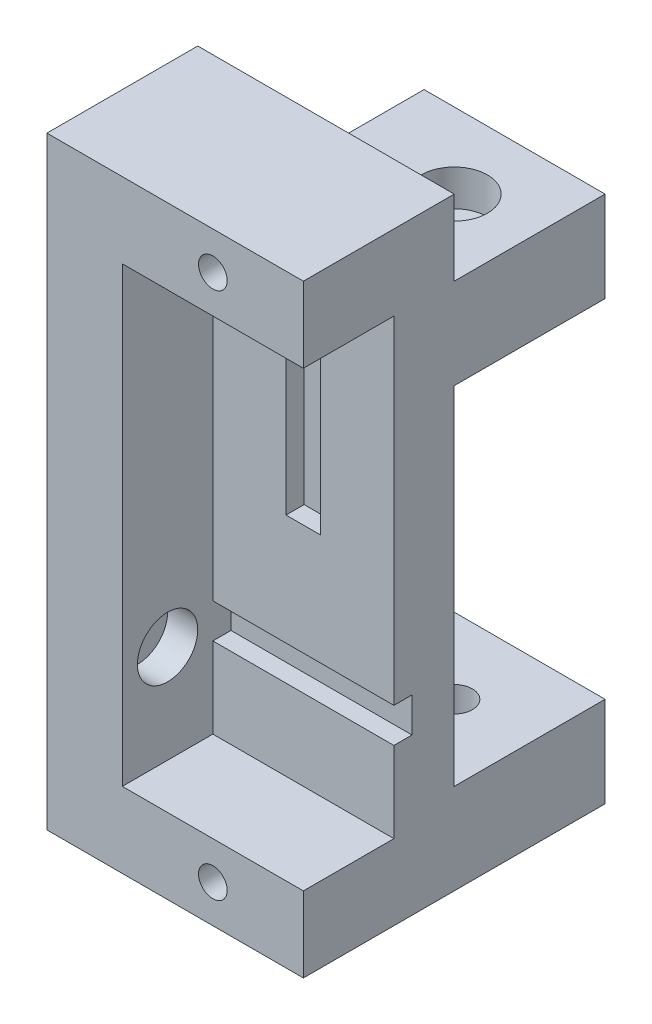
ISO-10303-21;
HEADER;
FILE_DESCRIPTION(('STEP AP214'),'2;1');
FILE_NAME('part.step','',(''),(''),'','','');
FILE_SCHEMA(('AUTOMOTIVE_DESIGN { 1 0 10303 214 1 1 1 1 }'));
ENDSEC;
DATA;
#1=APPLICATION_CONTEXT('core data for automotive mechanical design processes');
#2=APPLICATION_PROTOCOL_DEFINITION('international standard','automotive_design',2000,#1);
#3=PRODUCT_CONTEXT('',#1,'mechanical');
#4=PRODUCT('Part','Part','',(#3));
#5=PRODUCT_RELATED_PRODUCT_CATEGORY('part','',(#4));
#6=PRODUCT_DEFINITION_FORMATION('','',#4);
#7=PRODUCT_DEFINITION_CONTEXT('part definition',#1,'design');
#8=PRODUCT_DEFINITION('design','',#6,#7);
#9=PRODUCT_DEFINITION_SHAPE('','',#8);
#10=(LENGTH_UNIT() NAMED_UNIT(*) SI_UNIT(.MILLI.,.METRE.));
#11=(NAMED_UNIT(*) PLANE_ANGLE_UNIT() SI_UNIT($,.RADIAN.));
#12=(NAMED_UNIT(*) SI_UNIT($,.STERADIAN.) SOLID_ANGLE_UNIT());
#13=UNCERTAINTY_MEASURE_WITH_UNIT(LENGTH_MEASURE(1.E-05),#10,'distance_accuracy_value','');
#14=(GEOMETRIC_REPRESENTATION_CONTEXT(3) GLOBAL_UNCERTAINTY_ASSIGNED_CONTEXT((#13)) GLOBAL_UNIT_ASSIGNED_CONTEXT((#10,
#11,#12)) REPRESENTATION_CONTEXT('',''));
#15=CARTESIAN_POINT('',(0.,0.,0.));
#16=DIRECTION('',(0.,0.,1.));
#17=DIRECTION('',(1.,0.,0.));
#18=AXIS2_PLACEMENT_3D('',#15,#16,#17);
#19=CARTESIAN_POINT('',(0.,0.,4.));
#20=DIRECTION('',(0.,0.,-1.));
#21=DIRECTION('',(-1.,0.,0.));
#22=AXIS2_PLACEMENT_3D('',#19,#20,#21);
#23=PLANE('',#22);
#24=DIRECTION('',(0.,-1.,0.));
#25=VECTOR('',#24,1.);
#26=CARTESIAN_POINT('',(-2.,-17.5,4.));
#27=LINE('',#26,#25);
#28=CARTESIAN_POINT('',(-2.,17.5,4.));
#29=VERTEX_POINT('',#28);
#30=CARTESIAN_POINT('',(-2.,-4.85,4.));
#31=VERTEX_POINT('',#30);
#32=EDGE_CURVE('E399',#29,#31,#27,.T.);
#33=ORIENTED_EDGE('',*,*,#32,.T.);
#34=DIRECTION('',(-1.,0.,0.));
#35=VECTOR('',#34,1.);
#36=CARTESIAN_POINT('',(10.,-4.85,4.));
#37=LINE('',#36,#35);
#38=CARTESIAN_POINT('',(10.,-4.85,4.));
#39=VERTEX_POINT('',#38);
#40=EDGE_CURVE('E64',#39,#31,#37,.T.);
#41=ORIENTED_EDGE('',*,*,#40,.F.);
#42=DIRECTION('',(0.,1.,0.));
#43=VECTOR('',#42,1.);
#44=CARTESIAN_POINT('',(10.,-17.5,4.));
#45=LINE('',#44,#43);
#46=CARTESIAN_POINT('',(10.,17.5,4.));
#47=VERTEX_POINT('',#46);
#48=EDGE_CURVE('E402',#39,#47,#45,.T.);
#49=ORIENTED_EDGE('',*,*,#48,.T.);
#50=DIRECTION('',(1.,0.,0.));
#51=VECTOR('',#50,1.);
#52=CARTESIAN_POINT('',(-2.,17.5,4.));
#53=LINE('',#52,#51);
#54=CARTESIAN_POINT('',(5.15000000000001,17.5,4.));
#55=VERTEX_POINT('',#54);
#56=EDGE_CURVE('E327',#55,#47,#53,.T.);
#57=ORIENTED_EDGE('',*,*,#56,.F.);
#58=DIRECTION('',(0.,1.,0.));
#59=VECTOR('',#58,1.);
#60=CARTESIAN_POINT('',(5.15,2.5,4.));
#61=LINE('',#60,#59);
#62=CARTESIAN_POINT('',(5.15,2.5,4.));
#63=VERTEX_POINT('',#62);
#64=EDGE_CURVE('E56',#63,#55,#61,.T.);
#65=ORIENTED_EDGE('',*,*,#64,.F.);
#66=DIRECTION('',(1.,0.,0.));
#67=VECTOR('',#66,1.);
#68=CARTESIAN_POINT('',(2.85000000000001,2.5,4.));
#69=LINE('',#68,#67);
#70=CARTESIAN_POINT('',(2.85000000000001,2.5,4.));
#71=VERTEX_POINT('',#70);
#72=EDGE_CURVE('E244',#71,#63,#69,.T.);
#73=ORIENTED_EDGE('',*,*,#72,.F.);
#74=DIRECTION('',(0.,-1.,0.));
#75=VECTOR('',#74,1.);
#76=CARTESIAN_POINT('',(2.85000000000001,17.5,4.));
#77=LINE('',#76,#75);
#78=CARTESIAN_POINT('',(2.85000000000001,17.5,4.));
#79=VERTEX_POINT('',#78);
#80=EDGE_CURVE('E226',#79,#71,#77,.T.);
#81=ORIENTED_EDGE('',*,*,#80,.F.);
#82=EDGE_CURVE('E337',#29,#79,#53,.T.);
#83=ORIENTED_EDGE('',*,*,#82,.F.);
#84=EDGE_LOOP('',(#33,#41,#49,#57,#65,#73,#81,#83));
#85=FACE_BOUND('',#84,.T.);
#86=ADVANCED_FACE('F39',(#85),#23,.F.);
#87=CARTESIAN_POINT('',(-2.,-17.5,4.));
#88=DIRECTION('',(0.,1.,0.));
#89=DIRECTION('',(0.,0.,1.));
#90=AXIS2_PLACEMENT_3D('',#87,#88,#89);
#91=PLANE('',#90);
#92=DIRECTION('',(1.,0.,0.));
#93=VECTOR('',#92,1.);
#94=CARTESIAN_POINT('',(-2.,-17.5,10.));
#95=LINE('',#94,#93);
#96=CARTESIAN_POINT('',(-7.,-17.5,10.));
#97=VERTEX_POINT('',#96);
#98=CARTESIAN_POINT('',(10.,-17.5,10.));
#99=VERTEX_POINT('',#98);
#100=EDGE_CURVE('E328',#97,#99,#95,.T.);
#101=ORIENTED_EDGE('',*,*,#100,.F.);
#102=DIRECTION('',(0.,0.,1.));
#103=VECTOR('',#102,1.);
#104=CARTESIAN_POINT('',(-7.,-17.5,10.));
#105=LINE('',#104,#103);
#106=CARTESIAN_POINT('',(-7.,-17.5,0.));
#107=VERTEX_POINT('',#106);
#108=EDGE_CURVE('E298',#107,#97,#105,.T.);
#109=ORIENTED_EDGE('',*,*,#108,.F.);
#110=DIRECTION('',(1.,0.,0.));
#111=VECTOR('',#110,1.);
#112=CARTESIAN_POINT('',(-7.,-17.5,0.));
#113=LINE('',#112,#111);
#114=CARTESIAN_POINT('',(-2.,-17.5,0.));
#115=VERTEX_POINT('',#114);
#116=EDGE_CURVE('E301',#107,#115,#113,.T.);
#117=ORIENTED_EDGE('',*,*,#116,.T.);
#118=DIRECTION('',(0.,0.,-1.));
#119=VECTOR('',#118,1.);
#120=CARTESIAN_POINT('',(-2.,-17.5,4.));
#121=LINE('',#120,#119);
#122=CARTESIAN_POINT('',(-2.,-17.5,-10.));
#123=VERTEX_POINT('',#122);
#124=EDGE_CURVE('E43',#115,#123,#121,.T.);
#125=ORIENTED_EDGE('',*,*,#124,.T.);
#126=DIRECTION('',(-1.,0.,0.));
#127=VECTOR('',#126,1.);
#128=CARTESIAN_POINT('',(-2.,-17.5,-10.));
#129=LINE('',#128,#127);
#130=CARTESIAN_POINT('',(10.,-17.5,-10.));
#131=VERTEX_POINT('',#130);
#132=EDGE_CURVE('E387',#131,#123,#129,.T.);
#133=ORIENTED_EDGE('',*,*,#132,.F.);
#134=DIRECTION('',(0.,0.,-1.));
#135=VECTOR('',#134,1.);
#136=CARTESIAN_POINT('',(10.,-17.5,4.));
#137=LINE('',#136,#135);
#138=EDGE_CURVE('E413',#99,#131,#137,.T.);
#139=ORIENTED_EDGE('',*,*,#138,.F.);
#140=EDGE_LOOP('',(#101,#109,#117,#125,#133,#139));
#141=FACE_BOUND('',#140,.T.);
#142=CARTESIAN_POINT('',(5.,-17.5,-5.));
#143=DIRECTION('',(0.,-1.,0.));
#144=DIRECTION('',(0.,0.,-1.));
#145=AXIS2_PLACEMENT_3D('',#142,#143,#144);
#146=CIRCLE('',#145,2.19999999999999);
#147=CARTESIAN_POINT('',(5.,-17.5,-7.19999999999999));
#148=VERTEX_POINT('',#147);
#149=EDGE_CURVE('E271',#148,#148,#146,.T.);
#150=ORIENTED_EDGE('',*,*,#149,.F.);
#151=EDGE_LOOP('',(#150));
#152=FACE_BOUND('',#151,.T.);
#153=ADVANCED_FACE('F428',(#141,#152),#91,.F.);
#154=CARTESIAN_POINT('',(-2.,-17.5,4.));
#155=DIRECTION('',(1.,0.,0.));
#156=DIRECTION('',(0.,0.,-1.));
#157=AXIS2_PLACEMENT_3D('',#154,#155,#156);
#158=PLANE('',#157);
#159=DIRECTION('',(0.,-1.,0.));
#160=VECTOR('',#159,1.);
#161=CARTESIAN_POINT('',(-2.,22.5,0.));
#162=LINE('',#161,#160);
#163=CARTESIAN_POINT('',(-2.,17.5,0.));
#164=VERTEX_POINT('',#163);
#165=CARTESIAN_POINT('',(-2.,11.5,0.));
#166=VERTEX_POINT('',#165);
#167=EDGE_CURVE('E11',#164,#166,#162,.T.);
#168=ORIENTED_EDGE('',*,*,#167,.F.);
#169=DIRECTION('',(0.,0.,1.));
#170=VECTOR('',#169,1.);
#171=CARTESIAN_POINT('',(-2.,17.5,-10.));
#172=LINE('',#171,#170);
#173=CARTESIAN_POINT('',(-2.,17.5,-10.));
#174=VERTEX_POINT('',#173);
#175=EDGE_CURVE('E375',#174,#164,#172,.T.);
#176=ORIENTED_EDGE('',*,*,#175,.F.);
#177=DIRECTION('',(0.,-1.,0.));
#178=VECTOR('',#177,1.);
#179=CARTESIAN_POINT('',(-2.,17.5,-10.));
#180=LINE('',#179,#178);
#181=CARTESIAN_POINT('',(-2.,11.5,-10.));
#182=VERTEX_POINT('',#181);
#183=EDGE_CURVE('E351',#174,#182,#180,.T.);
#184=ORIENTED_EDGE('',*,*,#183,.T.);
#185=DIRECTION('',(0.,0.,1.));
#186=VECTOR('',#185,1.);
#187=CARTESIAN_POINT('',(-2.,11.5,-10.));
#188=LINE('',#187,#186);
#189=EDGE_CURVE('E364',#182,#166,#188,.T.);
#190=ORIENTED_EDGE('',*,*,#189,.T.);
#191=EDGE_LOOP('',(#168,#176,#184,#190));
#192=FACE_BOUND('',#191,.T.);
#193=ADVANCED_FACE('F41',(#192),#158,.F.);
#194=CARTESIAN_POINT('',(-2.,-11.5,0.));
#195=VERTEX_POINT('',#194);
#196=EDGE_CURVE('E48',#195,#115,#162,.T.);
#197=ORIENTED_EDGE('',*,*,#196,.F.);
#198=DIRECTION('',(0.,0.,1.));
#199=VECTOR('',#198,1.);
#200=CARTESIAN_POINT('',(-2.,-11.5,-10.));
#201=LINE('',#200,#199);
#202=CARTESIAN_POINT('',(-2.,-11.5,-10.));
#203=VERTEX_POINT('',#202);
#204=EDGE_CURVE('E395',#203,#195,#201,.T.);
#205=ORIENTED_EDGE('',*,*,#204,.F.);
#206=DIRECTION('',(0.,1.,0.));
#207=VECTOR('',#206,1.);
#208=CARTESIAN_POINT('',(-2.,-17.5,-10.));
#209=LINE('',#208,#207);
#210=EDGE_CURVE('E379',#123,#203,#209,.T.);
#211=ORIENTED_EDGE('',*,*,#210,.F.);
#212=ORIENTED_EDGE('',*,*,#124,.F.);
#213=EDGE_LOOP('',(#197,#205,#211,#212));
#214=FACE_BOUND('',#213,.T.);
#215=ADVANCED_FACE('F461',(#214),#158,.F.);
#216=CARTESIAN_POINT('',(10.,-12.5,4.));
#217=VERTEX_POINT('',#216);
#218=CARTESIAN_POINT('',(10.,-7.15,4.));
#219=VERTEX_POINT('',#218);
#220=EDGE_CURVE('E403',#217,#219,#45,.T.);
#221=ORIENTED_EDGE('',*,*,#220,.T.);
#222=DIRECTION('',(1.,0.,0.));
#223=VECTOR('',#222,1.);
#224=CARTESIAN_POINT('',(-2.,-7.15,4.));
#225=LINE('',#224,#223);
#226=CARTESIAN_POINT('',(-2.,-7.15,4.));
#227=VERTEX_POINT('',#226);
#228=EDGE_CURVE('E221',#227,#219,#225,.T.);
#229=ORIENTED_EDGE('',*,*,#228,.F.);
#230=CARTESIAN_POINT('',(-2.,-12.5,4.));
#231=VERTEX_POINT('',#230);
#232=EDGE_CURVE('E204',#227,#231,#27,.T.);
#233=ORIENTED_EDGE('',*,*,#232,.T.);
#234=DIRECTION('',(-1.,0.,0.));
#235=VECTOR('',#234,1.);
#236=CARTESIAN_POINT('',(-2.,-12.5,4.));
#237=LINE('',#236,#235);
#238=EDGE_CURVE('E324',#217,#231,#237,.T.);
#239=ORIENTED_EDGE('',*,*,#238,.F.);
#240=EDGE_LOOP('',(#221,#229,#233,#239));
#241=FACE_BOUND('',#240,.T.);
#242=ADVANCED_FACE('F478',(#241),#23,.F.);
#243=CARTESIAN_POINT('',(10.,-17.5,4.));
#244=DIRECTION('',(-1.,0.,0.));
#245=DIRECTION('',(0.,0.,1.));
#246=AXIS2_PLACEMENT_3D('',#243,#244,#245);
#247=PLANE('',#246);
#248=ORIENTED_EDGE('',*,*,#48,.F.);
#249=DIRECTION('',(0.,0.,1.));
#250=VECTOR('',#249,1.);
#251=CARTESIAN_POINT('',(10.,-4.85,2.8));
#252=LINE('',#251,#250);
#253=CARTESIAN_POINT('',(10.,-4.85,2.8));
#254=VERTEX_POINT('',#253);
#255=EDGE_CURVE('E231',#254,#39,#252,.T.);
#256=ORIENTED_EDGE('',*,*,#255,.F.);
#257=DIRECTION('',(0.,1.,0.));
#258=VECTOR('',#257,1.);
#259=CARTESIAN_POINT('',(10.,-7.15,2.8));
#260=LINE('',#259,#258);
#261=CARTESIAN_POINT('',(10.,-7.15,2.8));
#262=VERTEX_POINT('',#261);
#263=EDGE_CURVE('E216',#262,#254,#260,.T.);
#264=ORIENTED_EDGE('',*,*,#263,.F.);
#265=DIRECTION('',(0.,0.,1.));
#266=VECTOR('',#265,1.);
#267=CARTESIAN_POINT('',(10.,-7.15,2.8));
#268=LINE('',#267,#266);
#269=EDGE_CURVE('E207',#262,#219,#268,.T.);
#270=ORIENTED_EDGE('',*,*,#269,.T.);
#271=ORIENTED_EDGE('',*,*,#220,.F.);
#272=DIRECTION('',(0.,0.,-1.));
#273=VECTOR('',#272,1.);
#274=CARTESIAN_POINT('',(10.,-12.5,10.));
#275=LINE('',#274,#273);
#276=CARTESIAN_POINT('',(10.,-12.5,10.));
#277=VERTEX_POINT('',#276);
#278=EDGE_CURVE('E310',#277,#217,#275,.T.);
#279=ORIENTED_EDGE('',*,*,#278,.F.);
#280=DIRECTION('',(0.,1.,0.));
#281=VECTOR('',#280,1.);
#282=CARTESIAN_POINT('',(10.,-17.5,10.));
#283=LINE('',#282,#281);
#284=EDGE_CURVE('E330',#99,#277,#283,.T.);
#285=ORIENTED_EDGE('',*,*,#284,.F.);
#286=ORIENTED_EDGE('',*,*,#138,.T.);
#287=DIRECTION('',(0.,-1.,0.));
#288=VECTOR('',#287,1.);
#289=CARTESIAN_POINT('',(10.,-17.5,-10.));
#290=LINE('',#289,#288);
#291=CARTESIAN_POINT('',(10.,-11.5,-10.));
#292=VERTEX_POINT('',#291);
#293=EDGE_CURVE('E384',#292,#131,#290,.T.);
#294=ORIENTED_EDGE('',*,*,#293,.F.);
#295=DIRECTION('',(0.,0.,1.));
#296=VECTOR('',#295,1.);
#297=CARTESIAN_POINT('',(10.,-11.5,-10.));
#298=LINE('',#297,#296);
#299=CARTESIAN_POINT('',(10.,-11.5,0.));
#300=VERTEX_POINT('',#299);
#301=EDGE_CURVE('E390',#292,#300,#298,.T.);
#302=ORIENTED_EDGE('',*,*,#301,.T.);
#303=DIRECTION('',(0.,1.,0.));
#304=VECTOR('',#303,1.);
#305=CARTESIAN_POINT('',(10.,-17.5,0.));
#306=LINE('',#305,#304);
#307=CARTESIAN_POINT('',(10.,11.5,0.));
#308=VERTEX_POINT('',#307);
#309=EDGE_CURVE('E407',#300,#308,#306,.T.);
#310=ORIENTED_EDGE('',*,*,#309,.T.);
#311=DIRECTION('',(0.,0.,1.));
#312=VECTOR('',#311,1.);
#313=CARTESIAN_POINT('',(10.,11.5,-10.));
#314=LINE('',#313,#312);
#315=CARTESIAN_POINT('',(10.,11.5,-10.));
#316=VERTEX_POINT('',#315);
#317=EDGE_CURVE('E369',#316,#308,#314,.T.);
#318=ORIENTED_EDGE('',*,*,#317,.F.);
#319=DIRECTION('',(0.,1.,0.));
#320=VECTOR('',#319,1.);
#321=CARTESIAN_POINT('',(10.,17.5,-10.));
#322=LINE('',#321,#320);
#323=CARTESIAN_POINT('',(10.,17.5,-10.));
#324=VERTEX_POINT('',#323);
#325=EDGE_CURVE('E358',#316,#324,#322,.T.);
#326=ORIENTED_EDGE('',*,*,#325,.T.);
#327=DIRECTION('',(0.,0.,1.));
#328=VECTOR('',#327,1.);
#329=CARTESIAN_POINT('',(10.,17.5,-10.));
#330=LINE('',#329,#328);
#331=CARTESIAN_POINT('',(10.,17.5,0.));
#332=VERTEX_POINT('',#331);
#333=EDGE_CURVE('E372',#324,#332,#330,.T.);
#334=ORIENTED_EDGE('',*,*,#333,.T.);
#335=CARTESIAN_POINT('',(10.,22.5,0.));
#336=VERTEX_POINT('',#335);
#337=EDGE_CURVE('E398',#332,#336,#306,.T.);
#338=ORIENTED_EDGE('',*,*,#337,.T.);
#339=DIRECTION('',(0.,0.,-1.));
#340=VECTOR('',#339,1.);
#341=CARTESIAN_POINT('',(10.,22.5,4.));
#342=LINE('',#341,#340);
#343=CARTESIAN_POINT('',(10.,22.5,10.));
#344=VERTEX_POINT('',#343);
#345=EDGE_CURVE('E406',#344,#336,#342,.T.);
#346=ORIENTED_EDGE('',*,*,#345,.F.);
#347=DIRECTION('',(0.,1.,0.));
#348=VECTOR('',#347,1.);
#349=CARTESIAN_POINT('',(10.,22.5,10.));
#350=LINE('',#349,#348);
#351=CARTESIAN_POINT('',(10.,17.5,10.));
#352=VERTEX_POINT('',#351);
#353=EDGE_CURVE('E336',#352,#344,#350,.T.);
#354=ORIENTED_EDGE('',*,*,#353,.F.);
#355=DIRECTION('',(0.,0.,-1.));
#356=VECTOR('',#355,1.);
#357=CARTESIAN_POINT('',(10.,17.5,10.));
#358=LINE('',#357,#356);
#359=EDGE_CURVE('E342',#352,#47,#358,.T.);
#360=ORIENTED_EDGE('',*,*,#359,.T.);
#361=EDGE_LOOP('',(#248,#256,#264,#270,#271,#279,#285,#286,#294,#302,#310,#318,#326,#334,#338,
#346,#354,#360));
#362=FACE_BOUND('',#361,.T.);
#363=ADVANCED_FACE('F444',(#362),#247,.F.);
#364=CARTESIAN_POINT('',(-2.,22.5,4.));
#365=DIRECTION('',(0.,-1.,0.));
#366=DIRECTION('',(0.,0.,-1.));
#367=AXIS2_PLACEMENT_3D('',#364,#365,#366);
#368=PLANE('',#367);
#369=DIRECTION('',(-1.,0.,0.));
#370=VECTOR('',#369,1.);
#371=CARTESIAN_POINT('',(-2.,22.5,0.));
#372=LINE('',#371,#370);
#373=CARTESIAN_POINT('',(-7.,22.5,0.));
#374=VERTEX_POINT('',#373);
#375=EDGE_CURVE('E410',#336,#374,#372,.T.);
#376=ORIENTED_EDGE('',*,*,#375,.T.);
#377=DIRECTION('',(0.,0.,-1.));
#378=VECTOR('',#377,1.);
#379=CARTESIAN_POINT('',(-7.,22.5,10.));
#380=LINE('',#379,#378);
#381=CARTESIAN_POINT('',(-7.,22.5,10.));
#382=VERTEX_POINT('',#381);
#383=EDGE_CURVE('E293',#382,#374,#380,.T.);
#384=ORIENTED_EDGE('',*,*,#383,.F.);
#385=DIRECTION('',(-1.,0.,0.));
#386=VECTOR('',#385,1.);
#387=CARTESIAN_POINT('',(-2.,22.5,10.));
#388=LINE('',#387,#386);
#389=EDGE_CURVE('E340',#344,#382,#388,.T.);
#390=ORIENTED_EDGE('',*,*,#389,.F.);
#391=ORIENTED_EDGE('',*,*,#345,.T.);
#392=EDGE_LOOP('',(#376,#384,#390,#391));
#393=FACE_BOUND('',#392,.T.);
#394=ADVANCED_FACE('F440',(#393),#368,.F.);
#395=CARTESIAN_POINT('',(0.,0.,0.));
#396=DIRECTION('',(0.,0.,-1.));
#397=DIRECTION('',(-1.,0.,0.));
#398=AXIS2_PLACEMENT_3D('',#395,#396,#397);
#399=PLANE('',#398);
#400=DIRECTION('',(1.,0.,0.));
#401=VECTOR('',#400,1.);
#402=CARTESIAN_POINT('',(-2.,11.5,0.));
#403=LINE('',#402,#401);
#404=EDGE_CURVE('E355',#166,#308,#403,.T.);
#405=ORIENTED_EDGE('',*,*,#404,.T.);
#406=ORIENTED_EDGE('',*,*,#309,.F.);
#407=DIRECTION('',(1.,0.,0.));
#408=VECTOR('',#407,1.);
#409=CARTESIAN_POINT('',(-2.,-11.5,0.));
#410=LINE('',#409,#408);
#411=EDGE_CURVE('E378',#195,#300,#410,.T.);
#412=ORIENTED_EDGE('',*,*,#411,.F.);
#413=ORIENTED_EDGE('',*,*,#196,.T.);
#414=ORIENTED_EDGE('',*,*,#116,.F.);
#415=DIRECTION('',(0.,-1.,0.));
#416=VECTOR('',#415,1.);
#417=CARTESIAN_POINT('',(-7.,22.5,0.));
#418=LINE('',#417,#416);
#419=EDGE_CURVE('E296',#374,#107,#418,.T.);
#420=ORIENTED_EDGE('',*,*,#419,.F.);
#421=ORIENTED_EDGE('',*,*,#375,.F.);
#422=ORIENTED_EDGE('',*,*,#337,.F.);
#423=DIRECTION('',(-1.,0.,0.));
#424=VECTOR('',#423,1.);
#425=CARTESIAN_POINT('',(-2.,17.5,0.));
#426=LINE('',#425,#424);
#427=EDGE_CURVE('E350',#332,#164,#426,.T.);
#428=ORIENTED_EDGE('',*,*,#427,.T.);
#429=ORIENTED_EDGE('',*,*,#167,.T.);
#430=EDGE_LOOP('',(#405,#406,#412,#413,#414,#420,#421,#422,#428,#429));
#431=FACE_BOUND('',#430,.T.);
#432=ADVANCED_FACE('F423',(#431),#399,.T.);
#433=CARTESIAN_POINT('',(-2.,-11.5,-10.));
#434=DIRECTION('',(0.,-1.,0.));
#435=DIRECTION('',(0.,0.,-1.));
#436=AXIS2_PLACEMENT_3D('',#433,#434,#435);
#437=PLANE('',#436);
#438=CARTESIAN_POINT('',(5.,-11.5,-5.));
#439=DIRECTION('',(0.,-1.,0.));
#440=DIRECTION('',(0.,0.,-1.));
#441=AXIS2_PLACEMENT_3D('',#438,#439,#440);
#442=CIRCLE('',#441,1.20000000000001);
#443=CARTESIAN_POINT('',(5.,-11.5,-6.20000000000001));
#444=VERTEX_POINT('',#443);
#445=EDGE_CURVE('E280',#444,#444,#442,.T.);
#446=ORIENTED_EDGE('',*,*,#445,.T.);
#447=EDGE_LOOP('',(#446));
#448=FACE_BOUND('',#447,.T.);
#449=ORIENTED_EDGE('',*,*,#411,.T.);
#450=ORIENTED_EDGE('',*,*,#301,.F.);
#451=DIRECTION('',(1.,0.,0.));
#452=VECTOR('',#451,1.);
#453=CARTESIAN_POINT('',(-2.,-11.5,-10.));
#454=LINE('',#453,#452);
#455=EDGE_CURVE('E382',#203,#292,#454,.T.);
#456=ORIENTED_EDGE('',*,*,#455,.F.);
#457=ORIENTED_EDGE('',*,*,#204,.T.);
#458=EDGE_LOOP('',(#449,#450,#456,#457));
#459=FACE_BOUND('',#458,.T.);
#460=ADVANCED_FACE('F459',(#448,#459),#437,.F.);
#461=CARTESIAN_POINT('',(0.,0.,-10.));
#462=DIRECTION('',(0.,0.,-1.));
#463=DIRECTION('',(-1.,0.,0.));
#464=AXIS2_PLACEMENT_3D('',#461,#462,#463);
#465=PLANE('',#464);
#466=ORIENTED_EDGE('',*,*,#210,.T.);
#467=ORIENTED_EDGE('',*,*,#455,.T.);
#468=ORIENTED_EDGE('',*,*,#293,.T.);
#469=ORIENTED_EDGE('',*,*,#132,.T.);
#470=EDGE_LOOP('',(#466,#467,#468,#469));
#471=FACE_BOUND('',#470,.T.);
#472=ADVANCED_FACE('F463',(#471),#465,.T.);
#473=CARTESIAN_POINT('',(-2.,17.5,-10.));
#474=DIRECTION('',(0.,1.,0.));
#475=DIRECTION('',(0.,0.,1.));
#476=AXIS2_PLACEMENT_3D('',#473,#474,#475);
#477=PLANE('',#476);
#478=CARTESIAN_POINT('',(5.,17.5,-5.));
#479=DIRECTION('',(0.,1.,0.));
#480=DIRECTION('',(0.,0.,1.));
#481=AXIS2_PLACEMENT_3D('',#478,#479,#480);
#482=CIRCLE('',#481,2.19999999999999);
#483=CARTESIAN_POINT('',(5.,17.5,-2.80000000000001));
#484=VERTEX_POINT('',#483);
#485=EDGE_CURVE('E230',#484,#484,#482,.T.);
#486=ORIENTED_EDGE('',*,*,#485,.F.);
#487=EDGE_LOOP('',(#486));
#488=FACE_BOUND('',#487,.T.);
#489=ORIENTED_EDGE('',*,*,#427,.F.);
#490=ORIENTED_EDGE('',*,*,#333,.F.);
#491=DIRECTION('',(-1.,0.,0.));
#492=VECTOR('',#491,1.);
#493=CARTESIAN_POINT('',(-2.,17.5,-10.));
#494=LINE('',#493,#492);
#495=EDGE_CURVE('E354',#324,#174,#494,.T.);
#496=ORIENTED_EDGE('',*,*,#495,.T.);
#497=ORIENTED_EDGE('',*,*,#175,.T.);
#498=EDGE_LOOP('',(#489,#490,#496,#497));
#499=FACE_BOUND('',#498,.T.);
#500=ADVANCED_FACE('F448',(#488,#499),#477,.T.);
#501=CARTESIAN_POINT('',(-2.,11.5,-10.));
#502=DIRECTION('',(0.,-1.,0.));
#503=DIRECTION('',(0.,0.,-1.));
#504=AXIS2_PLACEMENT_3D('',#501,#502,#503);
#505=PLANE('',#504);
#506=CARTESIAN_POINT('',(5.,11.5,-5.));
#507=DIRECTION('',(0.,-1.,0.));
#508=DIRECTION('',(0.,0.,-1.));
#509=AXIS2_PLACEMENT_3D('',#506,#507,#508);
#510=CIRCLE('',#509,1.20000000000001);
#511=CARTESIAN_POINT('',(5.,11.5,-6.20000000000001));
#512=VERTEX_POINT('',#511);
#513=EDGE_CURVE('E268',#512,#512,#510,.T.);
#514=ORIENTED_EDGE('',*,*,#513,.F.);
#515=EDGE_LOOP('',(#514));
#516=FACE_BOUND('',#515,.T.);
#517=ORIENTED_EDGE('',*,*,#404,.F.);
#518=ORIENTED_EDGE('',*,*,#189,.F.);
#519=DIRECTION('',(1.,0.,0.));
#520=VECTOR('',#519,1.);
#521=CARTESIAN_POINT('',(-2.,11.5,-10.));
#522=LINE('',#521,#520);
#523=EDGE_CURVE('E361',#182,#316,#522,.T.);
#524=ORIENTED_EDGE('',*,*,#523,.T.);
#525=ORIENTED_EDGE('',*,*,#317,.T.);
#526=EDGE_LOOP('',(#517,#518,#524,#525));
#527=FACE_BOUND('',#526,.T.);
#528=ADVANCED_FACE('F456',(#516,#527),#505,.T.);
#529=CARTESIAN_POINT('',(0.,0.,-10.));
#530=DIRECTION('',(0.,0.,-1.));
#531=DIRECTION('',(-1.,0.,0.));
#532=AXIS2_PLACEMENT_3D('',#529,#530,#531);
#533=PLANE('',#532);
#534=ORIENTED_EDGE('',*,*,#183,.F.);
#535=ORIENTED_EDGE('',*,*,#495,.F.);
#536=ORIENTED_EDGE('',*,*,#325,.F.);
#537=ORIENTED_EDGE('',*,*,#523,.F.);
#538=EDGE_LOOP('',(#534,#535,#536,#537));
#539=FACE_BOUND('',#538,.T.);
#540=ADVANCED_FACE('F453',(#539),#533,.T.);
#541=CARTESIAN_POINT('',(-2.,17.5,10.));
#542=DIRECTION('',(0.,1.,0.));
#543=DIRECTION('',(-1.,0.,0.));
#544=AXIS2_PLACEMENT_3D('',#541,#542,#543);
#545=PLANE('',#544);
#546=ORIENTED_EDGE('',*,*,#82,.T.);
#547=DIRECTION('',(0.,0.,1.));
#548=VECTOR('',#547,1.);
#549=CARTESIAN_POINT('',(2.85000000000001,17.5,2.8));
#550=LINE('',#549,#548);
#551=CARTESIAN_POINT('',(2.85000000000001,17.5,2.8));
#552=VERTEX_POINT('',#551);
#553=EDGE_CURVE('E234',#552,#79,#550,.T.);
#554=ORIENTED_EDGE('',*,*,#553,.F.);
#555=DIRECTION('',(-1.,0.,0.));
#556=VECTOR('',#555,1.);
#557=CARTESIAN_POINT('',(5.15000000000001,17.5,2.8));
#558=LINE('',#557,#556);
#559=CARTESIAN_POINT('',(5.15000000000001,17.5,2.8));
#560=VERTEX_POINT('',#559);
#561=EDGE_CURVE('E245',#560,#552,#558,.T.);
#562=ORIENTED_EDGE('',*,*,#561,.F.);
#563=DIRECTION('',(0.,0.,1.));
#564=VECTOR('',#563,1.);
#565=CARTESIAN_POINT('',(5.15000000000001,17.5,2.8));
#566=LINE('',#565,#564);
#567=EDGE_CURVE('E241',#560,#55,#566,.T.);
#568=ORIENTED_EDGE('',*,*,#567,.T.);
#569=ORIENTED_EDGE('',*,*,#56,.T.);
#570=ORIENTED_EDGE('',*,*,#359,.F.);
#571=DIRECTION('',(1.,0.,0.));
#572=VECTOR('',#571,1.);
#573=CARTESIAN_POINT('',(-2.,17.5,10.));
#574=LINE('',#573,#572);
#575=CARTESIAN_POINT('',(-2.,17.5,10.));
#576=VERTEX_POINT('',#575);
#577=EDGE_CURVE('E334',#576,#352,#574,.T.);
#578=ORIENTED_EDGE('',*,*,#577,.F.);
#579=DIRECTION('',(0.,0.,-1.));
#580=VECTOR('',#579,1.);
#581=CARTESIAN_POINT('',(-2.,17.5,10.));
#582=LINE('',#581,#580);
#583=EDGE_CURVE('E347',#576,#29,#582,.T.);
#584=ORIENTED_EDGE('',*,*,#583,.T.);
#585=EDGE_LOOP('',(#546,#554,#562,#568,#569,#570,#578,#584));
#586=FACE_BOUND('',#585,.T.);
#587=ADVANCED_FACE('F501',(#586),#545,.F.);
#588=CARTESIAN_POINT('',(0.,0.,10.));
#589=DIRECTION('',(0.,0.,1.));
#590=DIRECTION('',(1.,0.,0.));
#591=AXIS2_PLACEMENT_3D('',#588,#589,#590);
#592=PLANE('',#591);
#593=CARTESIAN_POINT('',(4.,20.,10.));
#594=DIRECTION('',(0.,0.,1.));
#595=DIRECTION('',(-1.,0.,0.));
#596=AXIS2_PLACEMENT_3D('',#593,#594,#595);
#597=CIRCLE('',#596,0.95);
#598=CARTESIAN_POINT('',(3.05,20.,10.));
#599=VERTEX_POINT('',#598);
#600=EDGE_CURVE('E314',#599,#599,#597,.T.);
#601=ORIENTED_EDGE('',*,*,#600,.F.);
#602=EDGE_LOOP('',(#601));
#603=FACE_BOUND('',#602,.T.);
#604=ORIENTED_EDGE('',*,*,#389,.T.);
#605=DIRECTION('',(0.,1.,0.));
#606=VECTOR('',#605,1.);
#607=CARTESIAN_POINT('',(-7.,22.5,10.));
#608=LINE('',#607,#606);
#609=EDGE_CURVE('E290',#97,#382,#608,.T.);
#610=ORIENTED_EDGE('',*,*,#609,.F.);
#611=ORIENTED_EDGE('',*,*,#100,.T.);
#612=ORIENTED_EDGE('',*,*,#284,.T.);
#613=DIRECTION('',(-1.,0.,0.));
#614=VECTOR('',#613,1.);
#615=CARTESIAN_POINT('',(-2.,-12.5,10.));
#616=LINE('',#615,#614);
#617=CARTESIAN_POINT('',(-2.,-12.5,10.));
#618=VERTEX_POINT('',#617);
#619=EDGE_CURVE('E323',#277,#618,#616,.T.);
#620=ORIENTED_EDGE('',*,*,#619,.T.);
#621=DIRECTION('',(0.,1.,0.));
#622=VECTOR('',#621,1.);
#623=CARTESIAN_POINT('',(-2.,22.5,10.));
#624=LINE('',#623,#622);
#625=EDGE_CURVE('E287',#618,#576,#624,.T.);
#626=ORIENTED_EDGE('',*,*,#625,.T.);
#627=ORIENTED_EDGE('',*,*,#577,.T.);
#628=ORIENTED_EDGE('',*,*,#353,.T.);
#629=EDGE_LOOP('',(#604,#610,#611,#612,#620,#626,#627,#628));
#630=FACE_BOUND('',#629,.T.);
#631=CARTESIAN_POINT('',(4.,-15.,10.));
#632=DIRECTION('',(0.,0.,1.));
#633=DIRECTION('',(1.,0.,0.));
#634=AXIS2_PLACEMENT_3D('',#631,#632,#633);
#635=CIRCLE('',#634,0.95);
#636=CARTESIAN_POINT('',(4.95,-15.,10.));
#637=VERTEX_POINT('',#636);
#638=EDGE_CURVE('E311',#637,#637,#635,.T.);
#639=ORIENTED_EDGE('',*,*,#638,.F.);
#640=EDGE_LOOP('',(#639));
#641=FACE_BOUND('',#640,.T.);
#642=ADVANCED_FACE('F434',(#603,#630,#641),#592,.T.);
#643=CARTESIAN_POINT('',(-2.,-12.5,10.));
#644=DIRECTION('',(0.,-1.,0.));
#645=DIRECTION('',(0.,0.,-1.));
#646=AXIS2_PLACEMENT_3D('',#643,#644,#645);
#647=PLANE('',#646);
#648=ORIENTED_EDGE('',*,*,#238,.T.);
#649=DIRECTION('',(0.,0.,-1.));
#650=VECTOR('',#649,1.);
#651=CARTESIAN_POINT('',(-2.,-12.5,10.));
#652=LINE('',#651,#650);
#653=EDGE_CURVE('E321',#618,#231,#652,.T.);
#654=ORIENTED_EDGE('',*,*,#653,.F.);
#655=ORIENTED_EDGE('',*,*,#619,.F.);
#656=ORIENTED_EDGE('',*,*,#278,.T.);
#657=EDGE_LOOP('',(#648,#654,#655,#656));
#658=FACE_BOUND('',#657,.T.);
#659=ADVANCED_FACE('F505',(#658),#647,.F.);
#660=CARTESIAN_POINT('',(4.,-15.,5.));
#661=DIRECTION('',(0.,0.,1.));
#662=DIRECTION('',(1.,0.,0.));
#663=AXIS2_PLACEMENT_3D('',#660,#661,#662);
#664=CYLINDRICAL_SURFACE('',#663,0.95);
#665=CARTESIAN_POINT('',(4.,-15.,5.));
#666=DIRECTION('',(0.,0.,1.));
#667=DIRECTION('',(1.,0.,0.));
#668=AXIS2_PLACEMENT_3D('',#665,#666,#667);
#669=CIRCLE('',#668,0.95);
#670=CARTESIAN_POINT('',(4.95,-15.,5.));
#671=VERTEX_POINT('',#670);
#672=EDGE_CURVE('E307',#671,#671,#669,.T.);
#673=ORIENTED_EDGE('',*,*,#672,.F.);
#674=EDGE_LOOP('',(#673));
#675=FACE_BOUND('',#674,.T.);
#676=ORIENTED_EDGE('',*,*,#638,.T.);
#677=EDGE_LOOP('',(#676));
#678=FACE_BOUND('',#677,.T.);
#679=ADVANCED_FACE('F507',(#675,#678),#664,.F.);
#680=CARTESIAN_POINT('',(4.,-15.,5.));
#681=DIRECTION('',(0.,0.,1.));
#682=DIRECTION('',(1.,0.,0.));
#683=AXIS2_PLACEMENT_3D('',#680,#681,#682);
#684=PLANE('',#683);
#685=ORIENTED_EDGE('',*,*,#672,.T.);
#686=EDGE_LOOP('',(#685));
#687=FACE_BOUND('',#686,.T.);
#688=ADVANCED_FACE('F514',(#687),#684,.T.);
#689=CARTESIAN_POINT('',(4.,20.,5.));
#690=DIRECTION('',(0.,0.,1.));
#691=DIRECTION('',(1.,0.,0.));
#692=AXIS2_PLACEMENT_3D('',#689,#690,#691);
#693=CYLINDRICAL_SURFACE('',#692,0.95);
#694=CARTESIAN_POINT('',(4.,20.,5.));
#695=DIRECTION('',(0.,0.,1.));
#696=DIRECTION('',(-1.,0.,0.));
#697=AXIS2_PLACEMENT_3D('',#694,#695,#696);
#698=CIRCLE('',#697,0.95);
#699=CARTESIAN_POINT('',(3.05,20.,5.));
#700=VERTEX_POINT('',#699);
#701=EDGE_CURVE('E306',#700,#700,#698,.T.);
#702=ORIENTED_EDGE('',*,*,#701,.F.);
#703=EDGE_LOOP('',(#702));
#704=FACE_BOUND('',#703,.T.);
#705=ORIENTED_EDGE('',*,*,#600,.T.);
#706=EDGE_LOOP('',(#705));
#707=FACE_BOUND('',#706,.T.);
#708=ADVANCED_FACE('F570',(#704,#707),#693,.F.);
#709=CARTESIAN_POINT('',(4.,20.,5.));
#710=DIRECTION('',(0.,0.,-1.));
#711=DIRECTION('',(-1.,0.,0.));
#712=AXIS2_PLACEMENT_3D('',#709,#710,#711);
#713=PLANE('',#712);
#714=ORIENTED_EDGE('',*,*,#701,.T.);
#715=EDGE_LOOP('',(#714));
#716=FACE_BOUND('',#715,.T.);
#717=ADVANCED_FACE('F520',(#716),#713,.F.);
#718=CARTESIAN_POINT('',(-7.,0.,0.));
#719=DIRECTION('',(1.,0.,0.));
#720=DIRECTION('',(0.,1.,0.));
#721=AXIS2_PLACEMENT_3D('',#718,#719,#720);
#722=PLANE('',#721);
#723=ORIENTED_EDGE('',*,*,#609,.T.);
#724=ORIENTED_EDGE('',*,*,#383,.T.);
#725=ORIENTED_EDGE('',*,*,#419,.T.);
#726=ORIENTED_EDGE('',*,*,#108,.T.);
#727=EDGE_LOOP('',(#723,#724,#725,#726));
#728=FACE_BOUND('',#727,.T.);
#729=ADVANCED_FACE('F432',(#728),#722,.F.);
#730=CARTESIAN_POINT('',(-2.,0.,0.));
#731=DIRECTION('',(1.,0.,0.));
#732=DIRECTION('',(0.,1.,0.));
#733=AXIS2_PLACEMENT_3D('',#730,#731,#732);
#734=PLANE('',#733);
#735=CARTESIAN_POINT('',(-2.,-6.,7.));
#736=DIRECTION('',(1.,0.,0.));
#737=DIRECTION('',(0.,1.,0.));
#738=AXIS2_PLACEMENT_3D('',#735,#736,#737);
#739=CIRCLE('',#738,2.);
#740=CARTESIAN_POINT('',(-2.,-4.,7.));
#741=VERTEX_POINT('',#740);
#742=EDGE_CURVE('E283',#741,#741,#739,.T.);
#743=ORIENTED_EDGE('',*,*,#742,.F.);
#744=EDGE_LOOP('',(#743));
#745=FACE_BOUND('',#744,.T.);
#746=ORIENTED_EDGE('',*,*,#625,.F.);
#747=ORIENTED_EDGE('',*,*,#653,.T.);
#748=ORIENTED_EDGE('',*,*,#232,.F.);
#749=DIRECTION('',(0.,0.,1.));
#750=VECTOR('',#749,1.);
#751=CARTESIAN_POINT('',(-2.,-7.15,2.8));
#752=LINE('',#751,#750);
#753=CARTESIAN_POINT('',(-2.,-7.15,2.8));
#754=VERTEX_POINT('',#753);
#755=EDGE_CURVE('E196',#754,#227,#752,.T.);
#756=ORIENTED_EDGE('',*,*,#755,.F.);
#757=DIRECTION('',(0.,-1.,0.));
#758=VECTOR('',#757,1.);
#759=CARTESIAN_POINT('',(-2.,-4.85,2.8));
#760=LINE('',#759,#758);
#761=CARTESIAN_POINT('',(-2.,-4.85,2.8));
#762=VERTEX_POINT('',#761);
#763=EDGE_CURVE('E201',#762,#754,#760,.T.);
#764=ORIENTED_EDGE('',*,*,#763,.F.);
#765=DIRECTION('',(0.,0.,1.));
#766=VECTOR('',#765,1.);
#767=CARTESIAN_POINT('',(-2.,-4.85,2.8));
#768=LINE('',#767,#766);
#769=EDGE_CURVE('E228',#762,#31,#768,.T.);
#770=ORIENTED_EDGE('',*,*,#769,.T.);
#771=ORIENTED_EDGE('',*,*,#32,.F.);
#772=ORIENTED_EDGE('',*,*,#583,.F.);
#773=EDGE_LOOP('',(#746,#747,#748,#756,#764,#770,#771,#772));
#774=FACE_BOUND('',#773,.T.);
#775=ADVANCED_FACE('F199',(#745,#774),#734,.T.);
#776=CARTESIAN_POINT('',(-4.,-6.,7.));
#777=DIRECTION('',(1.,0.,0.));
#778=DIRECTION('',(0.,1.,0.));
#779=AXIS2_PLACEMENT_3D('',#776,#777,#778);
#780=CYLINDRICAL_SURFACE('',#779,2.);
#781=CARTESIAN_POINT('',(-4.,-6.,7.));
#782=DIRECTION('',(1.,0.,0.));
#783=DIRECTION('',(0.,1.,0.));
#784=AXIS2_PLACEMENT_3D('',#781,#782,#783);
#785=CIRCLE('',#784,2.);
#786=CARTESIAN_POINT('',(-4.,-4.,7.));
#787=VERTEX_POINT('',#786);
#788=EDGE_CURVE('E284',#787,#787,#785,.T.);
#789=ORIENTED_EDGE('',*,*,#788,.F.);
#790=EDGE_LOOP('',(#789));
#791=FACE_BOUND('',#790,.T.);
#792=ORIENTED_EDGE('',*,*,#742,.T.);
#793=EDGE_LOOP('',(#792));
#794=FACE_BOUND('',#793,.T.);
#795=ADVANCED_FACE('F560',(#791,#794),#780,.F.);
#796=CARTESIAN_POINT('',(-4.,-6.,7.));
#797=DIRECTION('',(1.,0.,0.));
#798=DIRECTION('',(0.,1.,0.));
#799=AXIS2_PLACEMENT_3D('',#796,#797,#798);
#800=PLANE('',#799);
#801=ORIENTED_EDGE('',*,*,#788,.T.);
#802=EDGE_LOOP('',(#801));
#803=FACE_BOUND('',#802,.T.);
#804=ADVANCED_FACE('F556',(#803),#800,.T.);
#805=CARTESIAN_POINT('',(5.,-17.5,-5.));
#806=DIRECTION('',(0.,-1.,0.));
#807=DIRECTION('',(0.,0.,-1.));
#808=AXIS2_PLACEMENT_3D('',#805,#806,#807);
#809=CYLINDRICAL_SURFACE('',#808,1.20000000000001);
#810=ORIENTED_EDGE('',*,*,#445,.F.);
#811=EDGE_LOOP('',(#810));
#812=FACE_BOUND('',#811,.T.);
#813=CARTESIAN_POINT('',(5.,-15.1,-5.));
#814=DIRECTION('',(0.,-1.,0.));
#815=DIRECTION('',(0.,0.,-1.));
#816=AXIS2_PLACEMENT_3D('',#813,#814,#815);
#817=CIRCLE('',#816,1.20000000000001);
#818=CARTESIAN_POINT('',(5.,-15.1,-6.20000000000001));
#819=VERTEX_POINT('',#818);
#820=EDGE_CURVE('E277',#819,#819,#817,.T.);
#821=ORIENTED_EDGE('',*,*,#820,.T.);
#822=EDGE_LOOP('',(#821));
#823=FACE_BOUND('',#822,.T.);
#824=ADVANCED_FACE('F552',(#812,#823),#809,.F.);
#825=CARTESIAN_POINT('',(6.20000000000001,-15.1,-5.));
#826=DIRECTION('',(0.,1.,0.));
#827=DIRECTION('',(0.,0.,1.));
#828=AXIS2_PLACEMENT_3D('',#825,#826,#827);
#829=PLANE('',#828);
#830=ORIENTED_EDGE('',*,*,#820,.F.);
#831=EDGE_LOOP('',(#830));
#832=FACE_BOUND('',#831,.T.);
#833=CARTESIAN_POINT('',(5.,-15.1,-5.));
#834=DIRECTION('',(0.,-1.,0.));
#835=DIRECTION('',(0.,0.,-1.));
#836=AXIS2_PLACEMENT_3D('',#833,#834,#835);
#837=CIRCLE('',#836,2.19999999999999);
#838=CARTESIAN_POINT('',(5.,-15.1,-7.19999999999999));
#839=VERTEX_POINT('',#838);
#840=EDGE_CURVE('E274',#839,#839,#837,.T.);
#841=ORIENTED_EDGE('',*,*,#840,.T.);
#842=EDGE_LOOP('',(#841));
#843=FACE_BOUND('',#842,.T.);
#844=ADVANCED_FACE('F545',(#832,#843),#829,.F.);
#845=CARTESIAN_POINT('',(5.,-17.5,-5.));
#846=DIRECTION('',(0.,-1.,0.));
#847=DIRECTION('',(0.,0.,-1.));
#848=AXIS2_PLACEMENT_3D('',#845,#846,#847);
#849=CYLINDRICAL_SURFACE('',#848,2.19999999999999);
#850=ORIENTED_EDGE('',*,*,#840,.F.);
#851=EDGE_LOOP('',(#850));
#852=FACE_BOUND('',#851,.T.);
#853=ORIENTED_EDGE('',*,*,#149,.T.);
#854=EDGE_LOOP('',(#853));
#855=FACE_BOUND('',#854,.T.);
#856=ADVANCED_FACE('F535',(#852,#855),#849,.F.);
#857=CARTESIAN_POINT('',(5.,17.5,-5.));
#858=DIRECTION('',(0.,1.,0.));
#859=DIRECTION('',(0.,0.,1.));
#860=AXIS2_PLACEMENT_3D('',#857,#858,#859);
#861=CYLINDRICAL_SURFACE('',#860,1.20000000000001);
#862=CARTESIAN_POINT('',(5.,15.1,-5.));
#863=DIRECTION('',(0.,1.,0.));
#864=DIRECTION('',(0.,0.,1.));
#865=AXIS2_PLACEMENT_3D('',#862,#863,#864);
#866=CIRCLE('',#865,1.20000000000001);
#867=CARTESIAN_POINT('',(5.,15.1,-3.79999999999999));
#868=VERTEX_POINT('',#867);
#869=EDGE_CURVE('E265',#868,#868,#866,.T.);
#870=ORIENTED_EDGE('',*,*,#869,.T.);
#871=EDGE_LOOP('',(#870));
#872=FACE_BOUND('',#871,.T.);
#873=ORIENTED_EDGE('',*,*,#513,.T.);
#874=EDGE_LOOP('',(#873));
#875=FACE_BOUND('',#874,.T.);
#876=ADVANCED_FACE('F533',(#872,#875),#861,.F.);
#877=CARTESIAN_POINT('',(6.20000000000001,15.1,-5.));
#878=DIRECTION('',(0.,-1.,0.));
#879=DIRECTION('',(0.,0.,-1.));
#880=AXIS2_PLACEMENT_3D('',#877,#878,#879);
#881=PLANE('',#880);
#882=ORIENTED_EDGE('',*,*,#869,.F.);
#883=EDGE_LOOP('',(#882));
#884=FACE_BOUND('',#883,.T.);
#885=CARTESIAN_POINT('',(5.,15.1,-5.));
#886=DIRECTION('',(0.,1.,0.));
#887=DIRECTION('',(0.,0.,1.));
#888=AXIS2_PLACEMENT_3D('',#885,#886,#887);
#889=CIRCLE('',#888,2.19999999999999);
#890=CARTESIAN_POINT('',(5.,15.1,-2.80000000000001));
#891=VERTEX_POINT('',#890);
#892=EDGE_CURVE('E262',#891,#891,#889,.T.);
#893=ORIENTED_EDGE('',*,*,#892,.T.);
#894=EDGE_LOOP('',(#893));
#895=FACE_BOUND('',#894,.T.);
#896=ADVANCED_FACE('F534',(#884,#895),#881,.F.);
#897=CARTESIAN_POINT('',(5.,17.5,-5.));
#898=DIRECTION('',(0.,1.,0.));
#899=DIRECTION('',(0.,0.,1.));
#900=AXIS2_PLACEMENT_3D('',#897,#898,#899);
#901=CYLINDRICAL_SURFACE('',#900,2.19999999999999);
#902=ORIENTED_EDGE('',*,*,#892,.F.);
#903=EDGE_LOOP('',(#902));
#904=FACE_BOUND('',#903,.T.);
#905=ORIENTED_EDGE('',*,*,#485,.T.);
#906=EDGE_LOOP('',(#905));
#907=FACE_BOUND('',#906,.T.);
#908=ADVANCED_FACE('F541',(#904,#907),#901,.F.);
#909=CARTESIAN_POINT('',(10.,-4.85,2.8));
#910=DIRECTION('',(0.,1.,0.));
#911=DIRECTION('',(0.,0.,1.));
#912=AXIS2_PLACEMENT_3D('',#909,#910,#911);
#913=PLANE('',#912);
#914=ORIENTED_EDGE('',*,*,#40,.T.);
#915=ORIENTED_EDGE('',*,*,#769,.F.);
#916=DIRECTION('',(-1.,0.,0.));
#917=VECTOR('',#916,1.);
#918=CARTESIAN_POINT('',(10.,-4.85,2.8));
#919=LINE('',#918,#917);
#920=EDGE_CURVE('E208',#254,#762,#919,.T.);
#921=ORIENTED_EDGE('',*,*,#920,.F.);
#922=ORIENTED_EDGE('',*,*,#255,.T.);
#923=EDGE_LOOP('',(#914,#915,#921,#922));
#924=FACE_BOUND('',#923,.T.);
#925=ADVANCED_FACE('F495',(#924),#913,.F.);
#926=CARTESIAN_POINT('',(-2.,-7.15,2.8));
#927=DIRECTION('',(0.,-1.,0.));
#928=DIRECTION('',(0.,0.,-1.));
#929=AXIS2_PLACEMENT_3D('',#926,#927,#928);
#930=PLANE('',#929);
#931=ORIENTED_EDGE('',*,*,#228,.T.);
#932=ORIENTED_EDGE('',*,*,#269,.F.);
#933=DIRECTION('',(1.,0.,0.));
#934=VECTOR('',#933,1.);
#935=CARTESIAN_POINT('',(-2.,-7.15,2.8));
#936=LINE('',#935,#934);
#937=EDGE_CURVE('E211',#754,#262,#936,.T.);
#938=ORIENTED_EDGE('',*,*,#937,.F.);
#939=ORIENTED_EDGE('',*,*,#755,.T.);
#940=EDGE_LOOP('',(#931,#932,#938,#939));
#941=FACE_BOUND('',#940,.T.);
#942=ADVANCED_FACE('F212',(#941),#930,.F.);
#943=CARTESIAN_POINT('',(0.,0.,2.8));
#944=DIRECTION('',(0.,0.,1.));
#945=DIRECTION('',(1.,0.,0.));
#946=AXIS2_PLACEMENT_3D('',#943,#944,#945);
#947=PLANE('',#946);
#948=ORIENTED_EDGE('',*,*,#763,.T.);
#949=ORIENTED_EDGE('',*,*,#937,.T.);
#950=ORIENTED_EDGE('',*,*,#263,.T.);
#951=ORIENTED_EDGE('',*,*,#920,.T.);
#952=EDGE_LOOP('',(#948,#949,#950,#951));
#953=FACE_BOUND('',#952,.T.);
#954=ADVANCED_FACE('F218',(#953),#947,.T.);
#955=CARTESIAN_POINT('',(5.15,2.5,2.8));
#956=DIRECTION('',(1.,0.,0.));
#957=DIRECTION('',(0.,1.,0.));
#958=AXIS2_PLACEMENT_3D('',#955,#956,#957);
#959=PLANE('',#958);
#960=ORIENTED_EDGE('',*,*,#64,.T.);
#961=ORIENTED_EDGE('',*,*,#567,.F.);
#962=DIRECTION('',(0.,1.,0.));
#963=VECTOR('',#962,1.);
#964=CARTESIAN_POINT('',(5.15,2.5,2.8));
#965=LINE('',#964,#963);
#966=CARTESIAN_POINT('',(5.15,2.5,2.8));
#967=VERTEX_POINT('',#966);
#968=EDGE_CURVE('E236',#967,#560,#965,.T.);
#969=ORIENTED_EDGE('',*,*,#968,.F.);
#970=DIRECTION('',(0.,0.,1.));
#971=VECTOR('',#970,1.);
#972=CARTESIAN_POINT('',(5.15,2.5,2.8));
#973=LINE('',#972,#971);
#974=EDGE_CURVE('E239',#967,#63,#973,.T.);
#975=ORIENTED_EDGE('',*,*,#974,.T.);
#976=EDGE_LOOP('',(#960,#961,#969,#975));
#977=FACE_BOUND('',#976,.T.);
#978=ADVANCED_FACE('F725',(#977),#959,.F.);
#979=CARTESIAN_POINT('',(2.85000000000001,2.5,2.8));
#980=DIRECTION('',(0.,-1.,0.));
#981=DIRECTION('',(0.,0.,-1.));
#982=AXIS2_PLACEMENT_3D('',#979,#980,#981);
#983=PLANE('',#982);
#984=ORIENTED_EDGE('',*,*,#72,.T.);
#985=ORIENTED_EDGE('',*,*,#974,.F.);
#986=DIRECTION('',(1.,0.,0.));
#987=VECTOR('',#986,1.);
#988=CARTESIAN_POINT('',(2.85000000000001,2.5,2.8));
#989=LINE('',#988,#987);
#990=CARTESIAN_POINT('',(2.85000000000001,2.5,2.8));
#991=VERTEX_POINT('',#990);
#992=EDGE_CURVE('E252',#991,#967,#989,.T.);
#993=ORIENTED_EDGE('',*,*,#992,.F.);
#994=DIRECTION('',(0.,0.,1.));
#995=VECTOR('',#994,1.);
#996=CARTESIAN_POINT('',(2.85000000000001,2.5,2.8));
#997=LINE('',#996,#995);
#998=EDGE_CURVE('E237',#991,#71,#997,.T.);
#999=ORIENTED_EDGE('',*,*,#998,.T.);
#1000=EDGE_LOOP('',(#984,#985,#993,#999));
#1001=FACE_BOUND('',#1000,.T.);
#1002=ADVANCED_FACE('F733',(#1001),#983,.F.);
#1003=CARTESIAN_POINT('',(2.85000000000001,17.5,2.8));
#1004=DIRECTION('',(-1.,0.,0.));
#1005=DIRECTION('',(0.,-1.,0.));
#1006=AXIS2_PLACEMENT_3D('',#1003,#1004,#1005);
#1007=PLANE('',#1006);
#1008=ORIENTED_EDGE('',*,*,#80,.T.);
#1009=ORIENTED_EDGE('',*,*,#998,.F.);
#1010=DIRECTION('',(0.,-1.,0.));
#1011=VECTOR('',#1010,1.);
#1012=CARTESIAN_POINT('',(2.85000000000001,17.5,2.8));
#1013=LINE('',#1012,#1011);
#1014=EDGE_CURVE('E255',#552,#991,#1013,.T.);
#1015=ORIENTED_EDGE('',*,*,#1014,.F.);
#1016=ORIENTED_EDGE('',*,*,#553,.T.);
#1017=EDGE_LOOP('',(#1008,#1009,#1015,#1016));
#1018=FACE_BOUND('',#1017,.T.);
#1019=ADVANCED_FACE('F741',(#1018),#1007,.F.);
#1020=CARTESIAN_POINT('',(0.,0.,2.8));
#1021=DIRECTION('',(0.,0.,1.));
#1022=DIRECTION('',(1.,0.,0.));
#1023=AXIS2_PLACEMENT_3D('',#1020,#1021,#1022);
#1024=PLANE('',#1023);
#1025=ORIENTED_EDGE('',*,*,#561,.T.);
#1026=ORIENTED_EDGE('',*,*,#1014,.T.);
#1027=ORIENTED_EDGE('',*,*,#992,.T.);
#1028=ORIENTED_EDGE('',*,*,#968,.T.);
#1029=EDGE_LOOP('',(#1025,#1026,#1027,#1028));
#1030=FACE_BOUND('',#1029,.T.);
#1031=ADVANCED_FACE('F750',(#1030),#1024,.T.);
#1032=CLOSED_SHELL('',(#86,#153,#193,#215,#242,#363,#394,#432,#460,#472,#500,#528,#540,#587,
#642,#659,#679,#688,#708,#717,#729,#775,#795,#804,#824,#844,#856,#876,#896,#908,#925,#942,#954,
#978,#1002,#1019,#1031));
#1033=MANIFOLD_SOLID_BREP('B2',#1032);
#1034=ADVANCED_BREP_SHAPE_REPRESENTATION('',(#18,#1033),#14);
#1035=SHAPE_DEFINITION_REPRESENTATION(#9,#1034);
ENDSEC;
END-ISO-10303-21;
